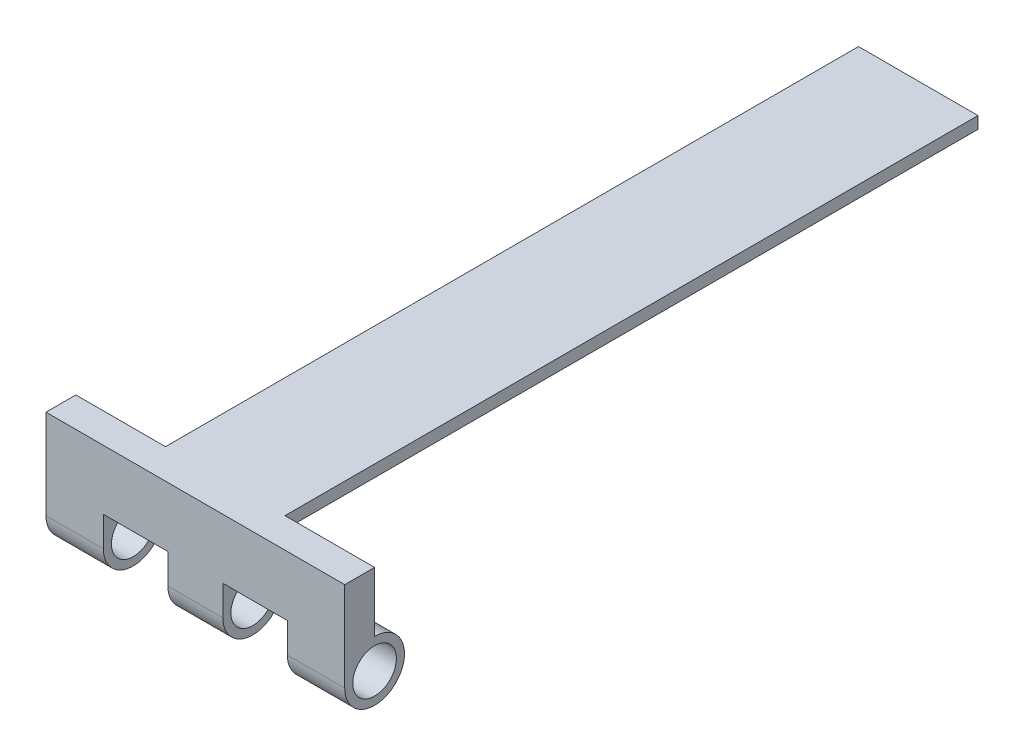
ISO-10303-21;
HEADER;
FILE_DESCRIPTION(('STEP AP214'),'2;1');
FILE_NAME('part.step','',(''),(''),'','','');
FILE_SCHEMA(('AUTOMOTIVE_DESIGN { 1 0 10303 214 1 1 1 1 }'));
ENDSEC;
DATA;
#1=APPLICATION_CONTEXT('core data for automotive mechanical design processes');
#2=APPLICATION_PROTOCOL_DEFINITION('international standard','automotive_design',2000,#1);
#3=PRODUCT_CONTEXT('',#1,'mechanical');
#4=PRODUCT('Part','Part','',(#3));
#5=PRODUCT_RELATED_PRODUCT_CATEGORY('part','',(#4));
#6=PRODUCT_DEFINITION_FORMATION('','',#4);
#7=PRODUCT_DEFINITION_CONTEXT('part definition',#1,'design');
#8=PRODUCT_DEFINITION('design','',#6,#7);
#9=PRODUCT_DEFINITION_SHAPE('','',#8);
#10=(LENGTH_UNIT() NAMED_UNIT(*) SI_UNIT(.MILLI.,.METRE.));
#11=(NAMED_UNIT(*) PLANE_ANGLE_UNIT() SI_UNIT($,.RADIAN.));
#12=(NAMED_UNIT(*) SI_UNIT($,.STERADIAN.) SOLID_ANGLE_UNIT());
#13=UNCERTAINTY_MEASURE_WITH_UNIT(LENGTH_MEASURE(1.E-05),#10,'distance_accuracy_value','');
#14=(GEOMETRIC_REPRESENTATION_CONTEXT(3) GLOBAL_UNCERTAINTY_ASSIGNED_CONTEXT((#13)) GLOBAL_UNIT_ASSIGNED_CONTEXT((#10,
#11,#12)) REPRESENTATION_CONTEXT('',''));
#15=CARTESIAN_POINT('',(0.,0.,0.));
#16=DIRECTION('',(0.,0.,1.));
#17=DIRECTION('',(1.,0.,0.));
#18=AXIS2_PLACEMENT_3D('',#15,#16,#17);
#19=CARTESIAN_POINT('',(31.75,0.,0.));
#20=DIRECTION('',(-1.,0.,0.));
#21=DIRECTION('',(0.,0.,1.));
#22=AXIS2_PLACEMENT_3D('',#19,#20,#21);
#23=CYLINDRICAL_SURFACE('',#22,6.35);
#24=DIRECTION('',(-1.,0.,0.));
#25=VECTOR('',#24,1.);
#26=CARTESIAN_POINT('',(31.75,6.35,0.));
#27=LINE('',#26,#25);
#28=CARTESIAN_POINT('',(-5.842,6.35,0.));
#29=VERTEX_POINT('',#28);
#30=CARTESIAN_POINT('',(5.842,6.35,0.));
#31=VERTEX_POINT('',#30);
#32=EDGE_CURVE('E284',#29,#31,#27,.F.);
#33=ORIENTED_EDGE('',*,*,#32,.T.);
#34=CARTESIAN_POINT('',(5.842,0.,0.));
#35=DIRECTION('',(-1.,0.,0.));
#36=DIRECTION('',(0.,-1.,0.));
#37=AXIS2_PLACEMENT_3D('',#34,#35,#36);
#38=CIRCLE('',#37,6.35);
#39=CARTESIAN_POINT('',(5.842,0.,6.35));
#40=VERTEX_POINT('',#39);
#41=EDGE_CURVE('E173',#31,#40,#38,.T.);
#42=ORIENTED_EDGE('',*,*,#41,.T.);
#43=DIRECTION('',(-1.,0.,0.));
#44=VECTOR('',#43,1.);
#45=CARTESIAN_POINT('',(31.75,0.,6.35));
#46=LINE('',#45,#44);
#47=CARTESIAN_POINT('',(-5.842,0.,6.35));
#48=VERTEX_POINT('',#47);
#49=EDGE_CURVE('E240',#40,#48,#46,.T.);
#50=ORIENTED_EDGE('',*,*,#49,.T.);
#51=CARTESIAN_POINT('',(-5.842,0.,0.));
#52=DIRECTION('',(1.,0.,0.));
#53=DIRECTION('',(0.,0.,-1.));
#54=AXIS2_PLACEMENT_3D('',#51,#52,#53);
#55=CIRCLE('',#54,6.35);
#56=EDGE_CURVE('E58',#48,#29,#55,.T.);
#57=ORIENTED_EDGE('',*,*,#56,.T.);
#58=EDGE_LOOP('',(#33,#42,#50,#57));
#59=FACE_BOUND('',#58,.T.);
#60=ADVANCED_FACE('F33',(#59),#23,.T.);
#61=CARTESIAN_POINT('',(31.75,0.,6.35));
#62=VERTEX_POINT('',#61);
#63=CARTESIAN_POINT('',(19.558,0.,6.35));
#64=VERTEX_POINT('',#63);
#65=EDGE_CURVE('E237',#62,#64,#46,.T.);
#66=ORIENTED_EDGE('',*,*,#65,.T.);
#67=CARTESIAN_POINT('',(19.558,0.,0.));
#68=DIRECTION('',(1.,0.,0.));
#69=DIRECTION('',(0.,1.,0.));
#70=AXIS2_PLACEMENT_3D('',#67,#68,#69);
#71=CIRCLE('',#70,6.35);
#72=CARTESIAN_POINT('',(19.558,6.35,0.));
#73=VERTEX_POINT('',#72);
#74=EDGE_CURVE('E50',#64,#73,#71,.T.);
#75=ORIENTED_EDGE('',*,*,#74,.T.);
#76=CARTESIAN_POINT('',(31.75,6.35,0.));
#77=VERTEX_POINT('',#76);
#78=EDGE_CURVE('E190',#73,#77,#27,.F.);
#79=ORIENTED_EDGE('',*,*,#78,.T.);
#80=CARTESIAN_POINT('',(31.75,0.,0.));
#81=DIRECTION('',(1.,0.,0.));
#82=DIRECTION('',(0.,0.,-1.));
#83=AXIS2_PLACEMENT_3D('',#80,#81,#82);
#84=CIRCLE('',#83,6.35);
#85=CARTESIAN_POINT('',(31.75,0.,-6.35));
#86=VERTEX_POINT('',#85);
#87=EDGE_CURVE('E183',#86,#77,#84,.T.);
#88=ORIENTED_EDGE('',*,*,#87,.F.);
#89=EDGE_CURVE('E180',#62,#86,#84,.T.);
#90=ORIENTED_EDGE('',*,*,#89,.F.);
#91=EDGE_LOOP('',(#66,#75,#79,#88,#90));
#92=FACE_BOUND('',#91,.T.);
#93=ADVANCED_FACE('F287',(#92),#23,.T.);
#94=CARTESIAN_POINT('',(-31.75,0.,0.));
#95=DIRECTION('',(1.,0.,0.));
#96=DIRECTION('',(0.,0.,-1.));
#97=AXIS2_PLACEMENT_3D('',#94,#95,#96);
#98=CYLINDRICAL_SURFACE('',#97,4.6355);
#99=CARTESIAN_POINT('',(-19.558,0.,0.));
#100=DIRECTION('',(-1.,0.,0.));
#101=DIRECTION('',(0.,0.,1.));
#102=AXIS2_PLACEMENT_3D('',#99,#100,#101);
#103=CIRCLE('',#102,4.6355);
#104=CARTESIAN_POINT('',(-19.558,0.,4.6355));
#105=VERTEX_POINT('',#104);
#106=EDGE_CURVE('E150',#105,#105,#103,.F.);
#107=ORIENTED_EDGE('',*,*,#106,.T.);
#108=EDGE_LOOP('',(#107));
#109=FACE_BOUND('',#108,.T.);
#110=CARTESIAN_POINT('',(-31.75,0.,0.));
#111=DIRECTION('',(1.,0.,0.));
#112=DIRECTION('',(0.,0.,-1.));
#113=AXIS2_PLACEMENT_3D('',#110,#111,#112);
#114=CIRCLE('',#113,4.6355);
#115=CARTESIAN_POINT('',(-31.75,0.,-4.6355));
#116=VERTEX_POINT('',#115);
#117=EDGE_CURVE('E177',#116,#116,#114,.T.);
#118=ORIENTED_EDGE('',*,*,#117,.F.);
#119=EDGE_LOOP('',(#118));
#120=FACE_BOUND('',#119,.T.);
#121=ADVANCED_FACE('F293',(#109,#120),#98,.F.);
#122=CARTESIAN_POINT('',(31.75,0.,0.));
#123=DIRECTION('',(0.,0.,1.));
#124=DIRECTION('',(0.,-1.,0.));
#125=AXIS2_PLACEMENT_3D('',#122,#123,#124);
#126=PLANE('',#125);
#127=CARTESIAN_POINT('',(-31.75,6.35,0.));
#128=VERTEX_POINT('',#127);
#129=CARTESIAN_POINT('',(-19.558,6.35,0.));
#130=VERTEX_POINT('',#129);
#131=EDGE_CURVE('E191',#128,#130,#27,.F.);
#132=ORIENTED_EDGE('',*,*,#131,.F.);
#133=DIRECTION('',(0.,1.,0.));
#134=VECTOR('',#133,1.);
#135=CARTESIAN_POINT('',(-31.75,0.,0.));
#136=LINE('',#135,#134);
#137=CARTESIAN_POINT('',(-31.75,19.05,0.));
#138=VERTEX_POINT('',#137);
#139=EDGE_CURVE('E223',#128,#138,#136,.T.);
#140=ORIENTED_EDGE('',*,*,#139,.T.);
#141=DIRECTION('',(-1.,0.,0.));
#142=VECTOR('',#141,1.);
#143=CARTESIAN_POINT('',(31.75,19.05,0.));
#144=LINE('',#143,#142);
#145=CARTESIAN_POINT('',(-12.7,19.05,0.));
#146=VERTEX_POINT('',#145);
#147=EDGE_CURVE('E42',#146,#138,#144,.T.);
#148=ORIENTED_EDGE('',*,*,#147,.F.);
#149=DIRECTION('',(0.,1.,0.));
#150=VECTOR('',#149,1.);
#151=CARTESIAN_POINT('',(-12.7,16.51,0.));
#152=LINE('',#151,#150);
#153=CARTESIAN_POINT('',(-12.7,16.51,0.));
#154=VERTEX_POINT('',#153);
#155=EDGE_CURVE('E198',#154,#146,#152,.T.);
#156=ORIENTED_EDGE('',*,*,#155,.F.);
#157=DIRECTION('',(-1.,0.,0.));
#158=VECTOR('',#157,1.);
#159=CARTESIAN_POINT('',(12.7,16.51,0.));
#160=LINE('',#159,#158);
#161=CARTESIAN_POINT('',(12.7,16.51,0.));
#162=VERTEX_POINT('',#161);
#163=EDGE_CURVE('E207',#162,#154,#160,.T.);
#164=ORIENTED_EDGE('',*,*,#163,.F.);
#165=DIRECTION('',(0.,1.,0.));
#166=VECTOR('',#165,1.);
#167=CARTESIAN_POINT('',(12.7,16.51,0.));
#168=LINE('',#167,#166);
#169=CARTESIAN_POINT('',(12.7,19.05,0.));
#170=VERTEX_POINT('',#169);
#171=EDGE_CURVE('E204',#162,#170,#168,.T.);
#172=ORIENTED_EDGE('',*,*,#171,.T.);
#173=CARTESIAN_POINT('',(31.75,19.05,0.));
#174=VERTEX_POINT('',#173);
#175=EDGE_CURVE('E11',#174,#170,#144,.T.);
#176=ORIENTED_EDGE('',*,*,#175,.F.);
#177=DIRECTION('',(0.,1.,0.));
#178=VECTOR('',#177,1.);
#179=CARTESIAN_POINT('',(31.75,0.,0.));
#180=LINE('',#179,#178);
#181=EDGE_CURVE('E224',#77,#174,#180,.T.);
#182=ORIENTED_EDGE('',*,*,#181,.F.);
#183=ORIENTED_EDGE('',*,*,#78,.F.);
#184=EDGE_CURVE('E279',#31,#73,#27,.F.);
#185=ORIENTED_EDGE('',*,*,#184,.F.);
#186=ORIENTED_EDGE('',*,*,#32,.F.);
#187=EDGE_CURVE('E158',#130,#29,#27,.F.);
#188=ORIENTED_EDGE('',*,*,#187,.F.);
#189=EDGE_LOOP('',(#132,#140,#148,#156,#164,#172,#176,#182,#183,#185,#186,#188));
#190=FACE_BOUND('',#189,.T.);
#191=ADVANCED_FACE('F35',(#190),#126,.F.);
#192=CARTESIAN_POINT('',(31.75,19.05,0.));
#193=DIRECTION('',(0.,-1.,0.));
#194=DIRECTION('',(0.,0.,-1.));
#195=AXIS2_PLACEMENT_3D('',#192,#193,#194);
#196=PLANE('',#195);
#197=DIRECTION('',(0.,0.,1.));
#198=VECTOR('',#197,1.);
#199=CARTESIAN_POINT('',(-31.75,19.05,0.));
#200=LINE('',#199,#198);
#201=CARTESIAN_POINT('',(-31.75,19.05,6.35));
#202=VERTEX_POINT('',#201);
#203=EDGE_CURVE('E233',#138,#202,#200,.T.);
#204=ORIENTED_EDGE('',*,*,#203,.T.);
#205=DIRECTION('',(-1.,0.,0.));
#206=VECTOR('',#205,1.);
#207=CARTESIAN_POINT('',(31.75,19.05,6.35));
#208=LINE('',#207,#206);
#209=CARTESIAN_POINT('',(31.75,19.05,6.35));
#210=VERTEX_POINT('',#209);
#211=EDGE_CURVE('E239',#210,#202,#208,.T.);
#212=ORIENTED_EDGE('',*,*,#211,.F.);
#213=DIRECTION('',(0.,0.,1.));
#214=VECTOR('',#213,1.);
#215=CARTESIAN_POINT('',(31.75,19.05,0.));
#216=LINE('',#215,#214);
#217=EDGE_CURVE('E226',#174,#210,#216,.T.);
#218=ORIENTED_EDGE('',*,*,#217,.F.);
#219=ORIENTED_EDGE('',*,*,#175,.T.);
#220=DIRECTION('',(0.,0.,-1.));
#221=VECTOR('',#220,1.);
#222=CARTESIAN_POINT('',(12.7,19.05,0.));
#223=LINE('',#222,#221);
#224=CARTESIAN_POINT('',(12.7,19.05,-147.32));
#225=VERTEX_POINT('',#224);
#226=EDGE_CURVE('E201',#170,#225,#223,.T.);
#227=ORIENTED_EDGE('',*,*,#226,.T.);
#228=DIRECTION('',(-1.,0.,0.));
#229=VECTOR('',#228,1.);
#230=CARTESIAN_POINT('',(12.7,19.05,-147.32));
#231=LINE('',#230,#229);
#232=CARTESIAN_POINT('',(-12.7,19.05,-147.32));
#233=VERTEX_POINT('',#232);
#234=EDGE_CURVE('E219',#225,#233,#231,.T.);
#235=ORIENTED_EDGE('',*,*,#234,.T.);
#236=DIRECTION('',(0.,0.,-1.));
#237=VECTOR('',#236,1.);
#238=CARTESIAN_POINT('',(-12.7,19.05,0.));
#239=LINE('',#238,#237);
#240=EDGE_CURVE('E213',#146,#233,#239,.T.);
#241=ORIENTED_EDGE('',*,*,#240,.F.);
#242=ORIENTED_EDGE('',*,*,#147,.T.);
#243=EDGE_LOOP('',(#204,#212,#218,#219,#227,#235,#241,#242));
#244=FACE_BOUND('',#243,.T.);
#245=ADVANCED_FACE('F318',(#244),#196,.F.);
#246=CARTESIAN_POINT('',(31.75,0.,6.35));
#247=DIRECTION('',(0.,0.,-1.));
#248=DIRECTION('',(-1.,0.,0.));
#249=AXIS2_PLACEMENT_3D('',#246,#247,#248);
#250=PLANE('',#249);
#251=ORIENTED_EDGE('',*,*,#49,.F.);
#252=DIRECTION('',(0.,1.,0.));
#253=VECTOR('',#252,1.);
#254=CARTESIAN_POINT('',(5.842,0.,6.35));
#255=LINE('',#254,#253);
#256=CARTESIAN_POINT('',(5.842,6.35,6.34999999999999));
#257=VERTEX_POINT('',#256);
#258=EDGE_CURVE('E167',#40,#257,#255,.T.);
#259=ORIENTED_EDGE('',*,*,#258,.T.);
#260=DIRECTION('',(1.,0.,0.));
#261=VECTOR('',#260,1.);
#262=CARTESIAN_POINT('',(31.75,6.35,6.35));
#263=LINE('',#262,#261);
#264=CARTESIAN_POINT('',(19.558,6.35,6.34999999999999));
#265=VERTEX_POINT('',#264);
#266=EDGE_CURVE('E166',#257,#265,#263,.T.);
#267=ORIENTED_EDGE('',*,*,#266,.T.);
#268=DIRECTION('',(0.,-1.,0.));
#269=VECTOR('',#268,1.);
#270=CARTESIAN_POINT('',(19.558,0.,6.35));
#271=LINE('',#270,#269);
#272=EDGE_CURVE('E253',#265,#64,#271,.T.);
#273=ORIENTED_EDGE('',*,*,#272,.T.);
#274=ORIENTED_EDGE('',*,*,#65,.F.);
#275=DIRECTION('',(0.,-1.,0.));
#276=VECTOR('',#275,1.);
#277=CARTESIAN_POINT('',(31.75,0.,6.35));
#278=LINE('',#277,#276);
#279=EDGE_CURVE('E229',#210,#62,#278,.T.);
#280=ORIENTED_EDGE('',*,*,#279,.F.);
#281=ORIENTED_EDGE('',*,*,#211,.T.);
#282=DIRECTION('',(0.,-1.,0.));
#283=VECTOR('',#282,1.);
#284=CARTESIAN_POINT('',(-31.75,0.,6.35));
#285=LINE('',#284,#283);
#286=CARTESIAN_POINT('',(-31.75,0.,6.35));
#287=VERTEX_POINT('',#286);
#288=EDGE_CURVE('E227',#202,#287,#285,.T.);
#289=ORIENTED_EDGE('',*,*,#288,.T.);
#290=CARTESIAN_POINT('',(-19.558,0.,6.35));
#291=VERTEX_POINT('',#290);
#292=EDGE_CURVE('E231',#291,#287,#46,.T.);
#293=ORIENTED_EDGE('',*,*,#292,.F.);
#294=DIRECTION('',(0.,1.,0.));
#295=VECTOR('',#294,1.);
#296=CARTESIAN_POINT('',(-19.558,0.,6.35));
#297=LINE('',#296,#295);
#298=CARTESIAN_POINT('',(-19.558,6.35,6.34999999999999));
#299=VERTEX_POINT('',#298);
#300=EDGE_CURVE('E165',#291,#299,#297,.T.);
#301=ORIENTED_EDGE('',*,*,#300,.T.);
#302=DIRECTION('',(1.,0.,0.));
#303=VECTOR('',#302,1.);
#304=CARTESIAN_POINT('',(31.75,6.35,6.35));
#305=LINE('',#304,#303);
#306=CARTESIAN_POINT('',(-5.842,6.35,6.34999999999999));
#307=VERTEX_POINT('',#306);
#308=EDGE_CURVE('E155',#299,#307,#305,.T.);
#309=ORIENTED_EDGE('',*,*,#308,.T.);
#310=DIRECTION('',(0.,-1.,0.));
#311=VECTOR('',#310,1.);
#312=CARTESIAN_POINT('',(-5.842,0.,6.35));
#313=LINE('',#312,#311);
#314=EDGE_CURVE('E142',#307,#48,#313,.T.);
#315=ORIENTED_EDGE('',*,*,#314,.T.);
#316=EDGE_LOOP('',(#251,#259,#267,#273,#274,#280,#281,#289,#293,#301,#309,#315));
#317=FACE_BOUND('',#316,.T.);
#318=ADVANCED_FACE('F163',(#317),#250,.F.);
#319=CARTESIAN_POINT('',(31.75,0.,0.));
#320=DIRECTION('',(1.,0.,0.));
#321=DIRECTION('',(0.,0.,-1.));
#322=AXIS2_PLACEMENT_3D('',#319,#320,#321);
#323=PLANE('',#322);
#324=CARTESIAN_POINT('',(31.75,0.,0.));
#325=DIRECTION('',(1.,0.,0.));
#326=DIRECTION('',(0.,0.,-1.));
#327=AXIS2_PLACEMENT_3D('',#324,#325,#326);
#328=CIRCLE('',#327,4.6355);
#329=CARTESIAN_POINT('',(31.75,0.,-4.6355));
#330=VERTEX_POINT('',#329);
#331=EDGE_CURVE('E170',#330,#330,#328,.T.);
#332=ORIENTED_EDGE('',*,*,#331,.F.);
#333=EDGE_LOOP('',(#332));
#334=FACE_BOUND('',#333,.T.);
#335=ORIENTED_EDGE('',*,*,#87,.T.);
#336=ORIENTED_EDGE('',*,*,#181,.T.);
#337=ORIENTED_EDGE('',*,*,#217,.T.);
#338=ORIENTED_EDGE('',*,*,#279,.T.);
#339=ORIENTED_EDGE('',*,*,#89,.T.);
#340=EDGE_LOOP('',(#335,#336,#337,#338,#339));
#341=FACE_BOUND('',#340,.T.);
#342=ADVANCED_FACE('F324',(#334,#341),#323,.T.);
#343=CARTESIAN_POINT('',(-31.75,0.,0.));
#344=DIRECTION('',(1.,0.,0.));
#345=DIRECTION('',(0.,0.,-1.));
#346=AXIS2_PLACEMENT_3D('',#343,#344,#345);
#347=PLANE('',#346);
#348=ORIENTED_EDGE('',*,*,#117,.T.);
#349=EDGE_LOOP('',(#348));
#350=FACE_BOUND('',#349,.T.);
#351=ORIENTED_EDGE('',*,*,#139,.F.);
#352=CARTESIAN_POINT('',(-31.75,0.,0.));
#353=DIRECTION('',(1.,0.,0.));
#354=DIRECTION('',(0.,0.,-1.));
#355=AXIS2_PLACEMENT_3D('',#352,#353,#354);
#356=CIRCLE('',#355,6.35);
#357=CARTESIAN_POINT('',(-31.75,0.,-6.35));
#358=VERTEX_POINT('',#357);
#359=EDGE_CURVE('E187',#358,#128,#356,.T.);
#360=ORIENTED_EDGE('',*,*,#359,.F.);
#361=EDGE_CURVE('E186',#287,#358,#356,.T.);
#362=ORIENTED_EDGE('',*,*,#361,.F.);
#363=ORIENTED_EDGE('',*,*,#288,.F.);
#364=ORIENTED_EDGE('',*,*,#203,.F.);
#365=EDGE_LOOP('',(#351,#360,#362,#363,#364));
#366=FACE_BOUND('',#365,.T.);
#367=ADVANCED_FACE('F313',(#350,#366),#347,.F.);
#368=CARTESIAN_POINT('',(12.7,16.51,0.));
#369=DIRECTION('',(0.,1.,0.));
#370=DIRECTION('',(0.,0.,1.));
#371=AXIS2_PLACEMENT_3D('',#368,#369,#370);
#372=PLANE('',#371);
#373=DIRECTION('',(0.,0.,-1.));
#374=VECTOR('',#373,1.);
#375=CARTESIAN_POINT('',(-12.7,16.51,0.));
#376=LINE('',#375,#374);
#377=CARTESIAN_POINT('',(-12.7,16.51,-147.32));
#378=VERTEX_POINT('',#377);
#379=EDGE_CURVE('E194',#154,#378,#376,.T.);
#380=ORIENTED_EDGE('',*,*,#379,.T.);
#381=DIRECTION('',(-1.,0.,0.));
#382=VECTOR('',#381,1.);
#383=CARTESIAN_POINT('',(12.7,16.51,-147.32));
#384=LINE('',#383,#382);
#385=CARTESIAN_POINT('',(12.7,16.51,-147.32));
#386=VERTEX_POINT('',#385);
#387=EDGE_CURVE('E221',#386,#378,#384,.T.);
#388=ORIENTED_EDGE('',*,*,#387,.F.);
#389=DIRECTION('',(0.,0.,-1.));
#390=VECTOR('',#389,1.);
#391=CARTESIAN_POINT('',(12.7,16.51,0.));
#392=LINE('',#391,#390);
#393=EDGE_CURVE('E195',#162,#386,#392,.T.);
#394=ORIENTED_EDGE('',*,*,#393,.F.);
#395=ORIENTED_EDGE('',*,*,#163,.T.);
#396=EDGE_LOOP('',(#380,#388,#394,#395));
#397=FACE_BOUND('',#396,.T.);
#398=ADVANCED_FACE('F338',(#397),#372,.F.);
#399=CARTESIAN_POINT('',(12.7,19.05,-147.32));
#400=DIRECTION('',(0.,0.,-1.));
#401=DIRECTION('',(-1.,0.,0.));
#402=AXIS2_PLACEMENT_3D('',#399,#400,#401);
#403=PLANE('',#402);
#404=DIRECTION('',(0.,-1.,0.));
#405=VECTOR('',#404,1.);
#406=CARTESIAN_POINT('',(-12.7,19.05,-147.32));
#407=LINE('',#406,#405);
#408=EDGE_CURVE('E210',#233,#378,#407,.T.);
#409=ORIENTED_EDGE('',*,*,#408,.F.);
#410=ORIENTED_EDGE('',*,*,#234,.F.);
#411=DIRECTION('',(0.,-1.,0.));
#412=VECTOR('',#411,1.);
#413=CARTESIAN_POINT('',(12.7,19.05,-147.32));
#414=LINE('',#413,#412);
#415=EDGE_CURVE('E197',#225,#386,#414,.T.);
#416=ORIENTED_EDGE('',*,*,#415,.T.);
#417=ORIENTED_EDGE('',*,*,#387,.T.);
#418=EDGE_LOOP('',(#409,#410,#416,#417));
#419=FACE_BOUND('',#418,.T.);
#420=ADVANCED_FACE('F335',(#419),#403,.T.);
#421=CARTESIAN_POINT('',(12.7,0.,0.));
#422=DIRECTION('',(-1.,0.,0.));
#423=DIRECTION('',(0.,0.,1.));
#424=AXIS2_PLACEMENT_3D('',#421,#422,#423);
#425=PLANE('',#424);
#426=ORIENTED_EDGE('',*,*,#393,.T.);
#427=ORIENTED_EDGE('',*,*,#415,.F.);
#428=ORIENTED_EDGE('',*,*,#226,.F.);
#429=ORIENTED_EDGE('',*,*,#171,.F.);
#430=EDGE_LOOP('',(#426,#427,#428,#429));
#431=FACE_BOUND('',#430,.T.);
#432=ADVANCED_FACE('F304',(#431),#425,.F.);
#433=CARTESIAN_POINT('',(-12.7,0.,0.));
#434=DIRECTION('',(-1.,0.,0.));
#435=DIRECTION('',(0.,0.,1.));
#436=AXIS2_PLACEMENT_3D('',#433,#434,#435);
#437=PLANE('',#436);
#438=ORIENTED_EDGE('',*,*,#379,.F.);
#439=ORIENTED_EDGE('',*,*,#155,.T.);
#440=ORIENTED_EDGE('',*,*,#240,.T.);
#441=ORIENTED_EDGE('',*,*,#408,.T.);
#442=EDGE_LOOP('',(#438,#439,#440,#441));
#443=FACE_BOUND('',#442,.T.);
#444=ADVANCED_FACE('F298',(#443),#437,.T.);
#445=ORIENTED_EDGE('',*,*,#131,.T.);
#446=CARTESIAN_POINT('',(-19.558,0.,0.));
#447=DIRECTION('',(-1.,0.,0.));
#448=DIRECTION('',(0.,0.,1.));
#449=AXIS2_PLACEMENT_3D('',#446,#447,#448);
#450=CIRCLE('',#449,6.35);
#451=EDGE_CURVE('E248',#130,#291,#450,.T.);
#452=ORIENTED_EDGE('',*,*,#451,.T.);
#453=ORIENTED_EDGE('',*,*,#292,.T.);
#454=ORIENTED_EDGE('',*,*,#361,.T.);
#455=ORIENTED_EDGE('',*,*,#359,.T.);
#456=EDGE_LOOP('',(#445,#452,#453,#454,#455));
#457=FACE_BOUND('',#456,.T.);
#458=ADVANCED_FACE('F289',(#457),#23,.T.);
#459=CARTESIAN_POINT('',(19.558,0.,0.));
#460=DIRECTION('',(1.,0.,0.));
#461=DIRECTION('',(0.,1.,0.));
#462=AXIS2_PLACEMENT_3D('',#459,#460,#461);
#463=CIRCLE('',#462,4.6355);
#464=CARTESIAN_POINT('',(19.558,4.6355,0.));
#465=VERTEX_POINT('',#464);
#466=EDGE_CURVE('E249',#465,#465,#463,.F.);
#467=ORIENTED_EDGE('',*,*,#466,.T.);
#468=EDGE_LOOP('',(#467));
#469=FACE_BOUND('',#468,.T.);
#470=ORIENTED_EDGE('',*,*,#331,.T.);
#471=EDGE_LOOP('',(#470));
#472=FACE_BOUND('',#471,.T.);
#473=ADVANCED_FACE('F297',(#469,#472),#98,.F.);
#474=CARTESIAN_POINT('',(-19.558,6.35,-147.32));
#475=DIRECTION('',(0.,1.,0.));
#476=DIRECTION('',(0.,0.,1.));
#477=AXIS2_PLACEMENT_3D('',#474,#475,#476);
#478=PLANE('',#477);
#479=DIRECTION('',(0.,0.,1.));
#480=VECTOR('',#479,1.);
#481=CARTESIAN_POINT('',(-19.558,6.35,-147.32));
#482=LINE('',#481,#480);
#483=EDGE_CURVE('E160',#130,#299,#482,.T.);
#484=ORIENTED_EDGE('',*,*,#483,.F.);
#485=ORIENTED_EDGE('',*,*,#187,.T.);
#486=DIRECTION('',(0.,0.,1.));
#487=VECTOR('',#486,1.);
#488=CARTESIAN_POINT('',(-5.842,6.35,-147.32));
#489=LINE('',#488,#487);
#490=EDGE_CURVE('E145',#29,#307,#489,.T.);
#491=ORIENTED_EDGE('',*,*,#490,.T.);
#492=ORIENTED_EDGE('',*,*,#308,.F.);
#493=EDGE_LOOP('',(#484,#485,#491,#492));
#494=FACE_BOUND('',#493,.T.);
#495=ADVANCED_FACE('F154',(#494),#478,.F.);
#496=CARTESIAN_POINT('',(-19.558,6.35,-147.32));
#497=DIRECTION('',(-1.,0.,0.));
#498=DIRECTION('',(0.,0.,1.));
#499=AXIS2_PLACEMENT_3D('',#496,#497,#498);
#500=PLANE('',#499);
#501=ORIENTED_EDGE('',*,*,#106,.F.);
#502=EDGE_LOOP('',(#501));
#503=FACE_BOUND('',#502,.T.);
#504=ORIENTED_EDGE('',*,*,#451,.F.);
#505=ORIENTED_EDGE('',*,*,#483,.T.);
#506=ORIENTED_EDGE('',*,*,#300,.F.);
#507=EDGE_LOOP('',(#504,#505,#506));
#508=FACE_BOUND('',#507,.T.);
#509=ADVANCED_FACE('F378',(#503,#508),#500,.F.);
#510=CARTESIAN_POINT('',(-5.842,6.35,-147.32));
#511=DIRECTION('',(1.,0.,0.));
#512=DIRECTION('',(0.,0.,-1.));
#513=AXIS2_PLACEMENT_3D('',#510,#511,#512);
#514=PLANE('',#513);
#515=CARTESIAN_POINT('',(-5.842,0.,0.));
#516=DIRECTION('',(1.,0.,0.));
#517=DIRECTION('',(0.,0.,-1.));
#518=AXIS2_PLACEMENT_3D('',#515,#516,#517);
#519=CIRCLE('',#518,4.6355);
#520=CARTESIAN_POINT('',(-5.842,0.,-4.6355));
#521=VERTEX_POINT('',#520);
#522=EDGE_CURVE('E243',#521,#521,#519,.F.);
#523=ORIENTED_EDGE('',*,*,#522,.F.);
#524=EDGE_LOOP('',(#523));
#525=FACE_BOUND('',#524,.T.);
#526=ORIENTED_EDGE('',*,*,#490,.F.);
#527=ORIENTED_EDGE('',*,*,#56,.F.);
#528=ORIENTED_EDGE('',*,*,#314,.F.);
#529=EDGE_LOOP('',(#526,#527,#528));
#530=FACE_BOUND('',#529,.T.);
#531=ADVANCED_FACE('F144',(#525,#530),#514,.F.);
#532=CARTESIAN_POINT('',(5.842,6.35,-147.32));
#533=DIRECTION('',(0.,1.,0.));
#534=DIRECTION('',(0.,0.,1.));
#535=AXIS2_PLACEMENT_3D('',#532,#533,#534);
#536=PLANE('',#535);
#537=DIRECTION('',(0.,0.,1.));
#538=VECTOR('',#537,1.);
#539=CARTESIAN_POINT('',(5.842,6.35,-147.32));
#540=LINE('',#539,#538);
#541=EDGE_CURVE('E246',#31,#257,#540,.T.);
#542=ORIENTED_EDGE('',*,*,#541,.F.);
#543=ORIENTED_EDGE('',*,*,#184,.T.);
#544=DIRECTION('',(0.,0.,1.));
#545=VECTOR('',#544,1.);
#546=CARTESIAN_POINT('',(19.558,6.35,-147.32));
#547=LINE('',#546,#545);
#548=EDGE_CURVE('E281',#73,#265,#547,.T.);
#549=ORIENTED_EDGE('',*,*,#548,.T.);
#550=ORIENTED_EDGE('',*,*,#266,.F.);
#551=EDGE_LOOP('',(#542,#543,#549,#550));
#552=FACE_BOUND('',#551,.T.);
#553=ADVANCED_FACE('F271',(#552),#536,.F.);
#554=CARTESIAN_POINT('',(5.842,6.35,-147.32));
#555=DIRECTION('',(-1.,0.,0.));
#556=DIRECTION('',(0.,-1.,0.));
#557=AXIS2_PLACEMENT_3D('',#554,#555,#556);
#558=PLANE('',#557);
#559=CARTESIAN_POINT('',(5.842,0.,0.));
#560=DIRECTION('',(-1.,0.,0.));
#561=DIRECTION('',(0.,-1.,0.));
#562=AXIS2_PLACEMENT_3D('',#559,#560,#561);
#563=CIRCLE('',#562,4.6355);
#564=CARTESIAN_POINT('',(5.842,-4.6355,0.));
#565=VERTEX_POINT('',#564);
#566=EDGE_CURVE('E37',#565,#565,#563,.F.);
#567=ORIENTED_EDGE('',*,*,#566,.F.);
#568=EDGE_LOOP('',(#567));
#569=FACE_BOUND('',#568,.T.);
#570=ORIENTED_EDGE('',*,*,#41,.F.);
#571=ORIENTED_EDGE('',*,*,#541,.T.);
#572=ORIENTED_EDGE('',*,*,#258,.F.);
#573=EDGE_LOOP('',(#570,#571,#572));
#574=FACE_BOUND('',#573,.T.);
#575=ADVANCED_FACE('F267',(#569,#574),#558,.F.);
#576=CARTESIAN_POINT('',(19.558,6.35,-147.32));
#577=DIRECTION('',(1.,0.,0.));
#578=DIRECTION('',(0.,1.,0.));
#579=AXIS2_PLACEMENT_3D('',#576,#577,#578);
#580=PLANE('',#579);
#581=ORIENTED_EDGE('',*,*,#466,.F.);
#582=EDGE_LOOP('',(#581));
#583=FACE_BOUND('',#582,.T.);
#584=ORIENTED_EDGE('',*,*,#548,.F.);
#585=ORIENTED_EDGE('',*,*,#74,.F.);
#586=ORIENTED_EDGE('',*,*,#272,.F.);
#587=EDGE_LOOP('',(#584,#585,#586));
#588=FACE_BOUND('',#587,.T.);
#589=ADVANCED_FACE('F270',(#583,#588),#580,.F.);
#590=ORIENTED_EDGE('',*,*,#566,.T.);
#591=EDGE_LOOP('',(#590));
#592=FACE_BOUND('',#591,.T.);
#593=ORIENTED_EDGE('',*,*,#522,.T.);
#594=EDGE_LOOP('',(#593));
#595=FACE_BOUND('',#594,.T.);
#596=ADVANCED_FACE('F264',(#592,#595),#98,.F.);
#597=CLOSED_SHELL('',(#60,#93,#121,#191,#245,#318,#342,#367,#398,#420,#432,#444,#458,#473,#495,
#509,#531,#553,#575,#589,#596));
#598=MANIFOLD_SOLID_BREP('B2',#597);
#599=ADVANCED_BREP_SHAPE_REPRESENTATION('',(#18,#598),#14);
#600=SHAPE_DEFINITION_REPRESENTATION(#9,#599);
ENDSEC;
END-ISO-10303-21;
